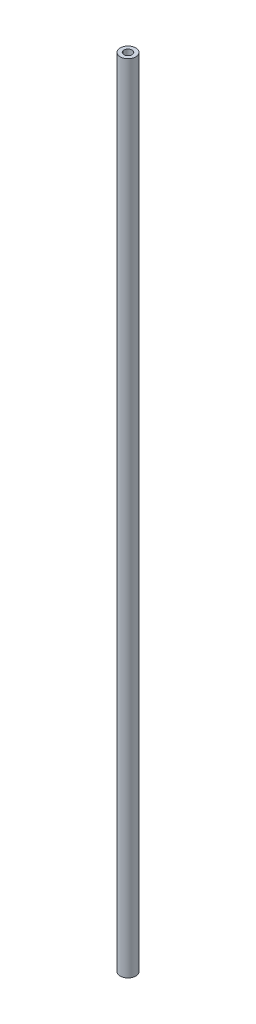
ISO-10303-21;
HEADER;
FILE_DESCRIPTION(('STEP AP214'),'2;1');
FILE_NAME('part.step','',(''),(''),'','','');
FILE_SCHEMA(('AUTOMOTIVE_DESIGN { 1 0 10303 214 1 1 1 1 }'));
ENDSEC;
DATA;
#1=APPLICATION_CONTEXT('core data for automotive mechanical design processes');
#2=APPLICATION_PROTOCOL_DEFINITION('international standard','automotive_design',2000,#1);
#3=PRODUCT_CONTEXT('',#1,'mechanical');
#4=PRODUCT('Part','Part','',(#3));
#5=PRODUCT_RELATED_PRODUCT_CATEGORY('part','',(#4));
#6=PRODUCT_DEFINITION_FORMATION('','',#4);
#7=PRODUCT_DEFINITION_CONTEXT('part definition',#1,'design');
#8=PRODUCT_DEFINITION('design','',#6,#7);
#9=PRODUCT_DEFINITION_SHAPE('','',#8);
#10=(LENGTH_UNIT() NAMED_UNIT(*) SI_UNIT(.MILLI.,.METRE.));
#11=(NAMED_UNIT(*) PLANE_ANGLE_UNIT() SI_UNIT($,.RADIAN.));
#12=(NAMED_UNIT(*) SI_UNIT($,.STERADIAN.) SOLID_ANGLE_UNIT());
#13=UNCERTAINTY_MEASURE_WITH_UNIT(LENGTH_MEASURE(1.E-05),#10,'distance_accuracy_value','');
#14=(GEOMETRIC_REPRESENTATION_CONTEXT(3) GLOBAL_UNCERTAINTY_ASSIGNED_CONTEXT((#13)) GLOBAL_UNIT_ASSIGNED_CONTEXT((#10,
#11,#12)) REPRESENTATION_CONTEXT('',''));
#15=CARTESIAN_POINT('',(0.,0.,0.));
#16=DIRECTION('',(0.,0.,1.));
#17=DIRECTION('',(1.,0.,0.));
#18=AXIS2_PLACEMENT_3D('',#15,#16,#17);
#19=CARTESIAN_POINT('',(-40.,-243.6,0.));
#20=DIRECTION('',(0.,1.,0.));
#21=DIRECTION('',(-1.,0.,0.));
#22=AXIS2_PLACEMENT_3D('',#19,#20,#21);
#23=CYLINDRICAL_SURFACE('',#22,2.38125000000004);
#24=CARTESIAN_POINT('',(-40.,-238.6,0.));
#25=DIRECTION('',(0.,-1.,0.));
#26=DIRECTION('',(0.,0.,-1.));
#27=AXIS2_PLACEMENT_3D('',#24,#25,#26);
#28=CIRCLE('',#27,2.38125000000004);
#29=CARTESIAN_POINT('',(-42.38125,-238.6,0.));
#30=VERTEX_POINT('',#29);
#31=CARTESIAN_POINT('',(-41.88125,-238.6,1.45988013206566));
#32=VERTEX_POINT('',#31);
#33=EDGE_CURVE('E113',#30,#32,#28,.F.);
#34=ORIENTED_EDGE('',*,*,#33,.F.);
#35=DIRECTION('',(0.,1.,0.));
#36=VECTOR('',#35,1.);
#37=CARTESIAN_POINT('',(-42.38125,-243.6,0.));
#38=LINE('',#37,#36);
#39=CARTESIAN_POINT('',(-42.38125,-243.6,0.));
#40=VERTEX_POINT('',#39);
#41=EDGE_CURVE('E11',#30,#40,#38,.F.);
#42=ORIENTED_EDGE('',*,*,#41,.T.);
#43=CARTESIAN_POINT('',(-40.,-243.6,0.));
#44=DIRECTION('',(0.,1.,0.));
#45=DIRECTION('',(-1.,0.,0.));
#46=AXIS2_PLACEMENT_3D('',#43,#44,#45);
#47=CIRCLE('',#46,2.38125);
#48=CARTESIAN_POINT('',(-41.88125,-243.6,1.45988013206563));
#49=VERTEX_POINT('',#48);
#50=EDGE_CURVE('E105',#40,#49,#47,.T.);
#51=ORIENTED_EDGE('',*,*,#50,.T.);
#52=DIRECTION('',(0.,1.,0.));
#53=VECTOR('',#52,1.);
#54=CARTESIAN_POINT('',(-41.88125,-243.6,1.45988013206566));
#55=LINE('',#54,#53);
#56=EDGE_CURVE('E56',#32,#49,#55,.F.);
#57=ORIENTED_EDGE('',*,*,#56,.F.);
#58=EDGE_LOOP('',(#34,#42,#51,#57));
#59=FACE_BOUND('',#58,.T.);
#60=ADVANCED_FACE('F47',(#59),#23,.T.);
#61=CARTESIAN_POINT('',(-39.9999999999999,0.,0.));
#62=DIRECTION('',(0.,1.,0.));
#63=DIRECTION('',(-1.,0.,0.));
#64=AXIS2_PLACEMENT_3D('',#61,#62,#63);
#65=CIRCLE('',#64,2.38125000000008);
#66=CARTESIAN_POINT('',(-42.38125,0.,0.));
#67=VERTEX_POINT('',#66);
#68=EDGE_CURVE('E110',#67,#67,#65,.T.);
#69=ORIENTED_EDGE('',*,*,#68,.F.);
#70=EDGE_LOOP('',(#69));
#71=FACE_BOUND('',#70,.T.);
#72=ORIENTED_EDGE('',*,*,#33,.T.);
#73=ORIENTED_EDGE('',*,*,#56,.T.);
#74=CARTESIAN_POINT('',(-41.88125,-243.6,-1.45988013206563));
#75=VERTEX_POINT('',#74);
#76=EDGE_CURVE('E103',#49,#75,#47,.T.);
#77=ORIENTED_EDGE('',*,*,#76,.T.);
#78=DIRECTION('',(0.,1.,0.));
#79=VECTOR('',#78,1.);
#80=CARTESIAN_POINT('',(-41.88125,-243.6,-1.45988013206566));
#81=LINE('',#80,#79);
#82=CARTESIAN_POINT('',(-41.88125,-238.6,-1.45988013206566));
#83=VERTEX_POINT('',#82);
#84=EDGE_CURVE('E63',#75,#83,#81,.T.);
#85=ORIENTED_EDGE('',*,*,#84,.T.);
#86=EDGE_CURVE('E116',#83,#30,#28,.F.);
#87=ORIENTED_EDGE('',*,*,#86,.T.);
#88=EDGE_LOOP('',(#72,#73,#77,#85,#87));
#89=FACE_BOUND('',#88,.T.);
#90=ADVANCED_FACE('F122',(#71,#89),#23,.T.);
#91=CARTESIAN_POINT('',(0.,0.,0.));
#92=DIRECTION('',(0.,-1.,0.));
#93=DIRECTION('',(1.,0.,0.));
#94=AXIS2_PLACEMENT_3D('',#91,#92,#93);
#95=PLANE('',#94);
#96=CARTESIAN_POINT('',(-40.,0.,0.));
#97=DIRECTION('',(0.,1.,0.));
#98=DIRECTION('',(0.,0.,1.));
#99=AXIS2_PLACEMENT_3D('',#96,#97,#98);
#100=CIRCLE('',#99,1.24999999999999);
#101=CARTESIAN_POINT('',(-40.,0.,1.24999999999999));
#102=VERTEX_POINT('',#101);
#103=EDGE_CURVE('E96',#102,#102,#100,.T.);
#104=ORIENTED_EDGE('',*,*,#103,.F.);
#105=EDGE_LOOP('',(#104));
#106=FACE_BOUND('',#105,.T.);
#107=ORIENTED_EDGE('',*,*,#68,.T.);
#108=EDGE_LOOP('',(#107));
#109=FACE_BOUND('',#108,.T.);
#110=ADVANCED_FACE('F49',(#106,#109),#95,.F.);
#111=ORIENTED_EDGE('',*,*,#41,.F.);
#112=ORIENTED_EDGE('',*,*,#86,.F.);
#113=ORIENTED_EDGE('',*,*,#84,.F.);
#114=EDGE_CURVE('E95',#75,#40,#47,.T.);
#115=ORIENTED_EDGE('',*,*,#114,.T.);
#116=EDGE_LOOP('',(#111,#112,#113,#115));
#117=FACE_BOUND('',#116,.T.);
#118=ADVANCED_FACE('F128',(#117),#23,.T.);
#119=CARTESIAN_POINT('',(0.,-243.6,0.));
#120=DIRECTION('',(0.,-1.,0.));
#121=DIRECTION('',(1.,0.,0.));
#122=AXIS2_PLACEMENT_3D('',#119,#120,#121);
#123=PLANE('',#122);
#124=ORIENTED_EDGE('',*,*,#50,.F.);
#125=ORIENTED_EDGE('',*,*,#114,.F.);
#126=ORIENTED_EDGE('',*,*,#76,.F.);
#127=EDGE_LOOP('',(#124,#125,#126));
#128=FACE_BOUND('',#127,.T.);
#129=ADVANCED_FACE('F88',(#128),#123,.T.);
#130=CARTESIAN_POINT('',(-40.,-7.50000000000001,0.));
#131=DIRECTION('',(0.,1.,0.));
#132=DIRECTION('',(0.,0.,1.));
#133=AXIS2_PLACEMENT_3D('',#130,#131,#132);
#134=CONICAL_SURFACE('',#133,1.24999999999999,1.02974425867665);
#135=CARTESIAN_POINT('',(-40.,-8.25107577378445,0.));
#136=VERTEX_POINT('',#135);
#137=VERTEX_LOOP('',#136);
#138=FACE_BOUND('',#137,.T.);
#139=CARTESIAN_POINT('',(-40.,-7.50000000000001,0.));
#140=DIRECTION('',(0.,1.,0.));
#141=DIRECTION('',(0.,0.,1.));
#142=AXIS2_PLACEMENT_3D('',#139,#140,#141);
#143=CIRCLE('',#142,1.24999999999999);
#144=CARTESIAN_POINT('',(-40.,-7.50000000000001,1.24999999999999));
#145=VERTEX_POINT('',#144);
#146=EDGE_CURVE('E92',#145,#145,#143,.T.);
#147=ORIENTED_EDGE('',*,*,#146,.T.);
#148=EDGE_LOOP('',(#147));
#149=FACE_BOUND('',#148,.T.);
#150=ADVANCED_FACE('F84',(#138,#149),#134,.F.);
#151=CARTESIAN_POINT('',(-40.,0.,0.));
#152=DIRECTION('',(0.,1.,0.));
#153=DIRECTION('',(0.,0.,1.));
#154=AXIS2_PLACEMENT_3D('',#151,#152,#153);
#155=CYLINDRICAL_SURFACE('',#154,1.24999999999999);
#156=ORIENTED_EDGE('',*,*,#146,.F.);
#157=EDGE_LOOP('',(#156));
#158=FACE_BOUND('',#157,.T.);
#159=ORIENTED_EDGE('',*,*,#103,.T.);
#160=EDGE_LOOP('',(#159));
#161=FACE_BOUND('',#160,.T.);
#162=ADVANCED_FACE('F87',(#158,#161),#155,.F.);
#163=CLOSED_SHELL('',(#60,#90,#110,#118,#129,#150,#162));
#164=MANIFOLD_SOLID_BREP('B2',#163);
#165=ADVANCED_BREP_SHAPE_REPRESENTATION('',(#18,#164),#14);
#166=SHAPE_DEFINITION_REPRESENTATION(#9,#165);
ENDSEC;
END-ISO-10303-21;
